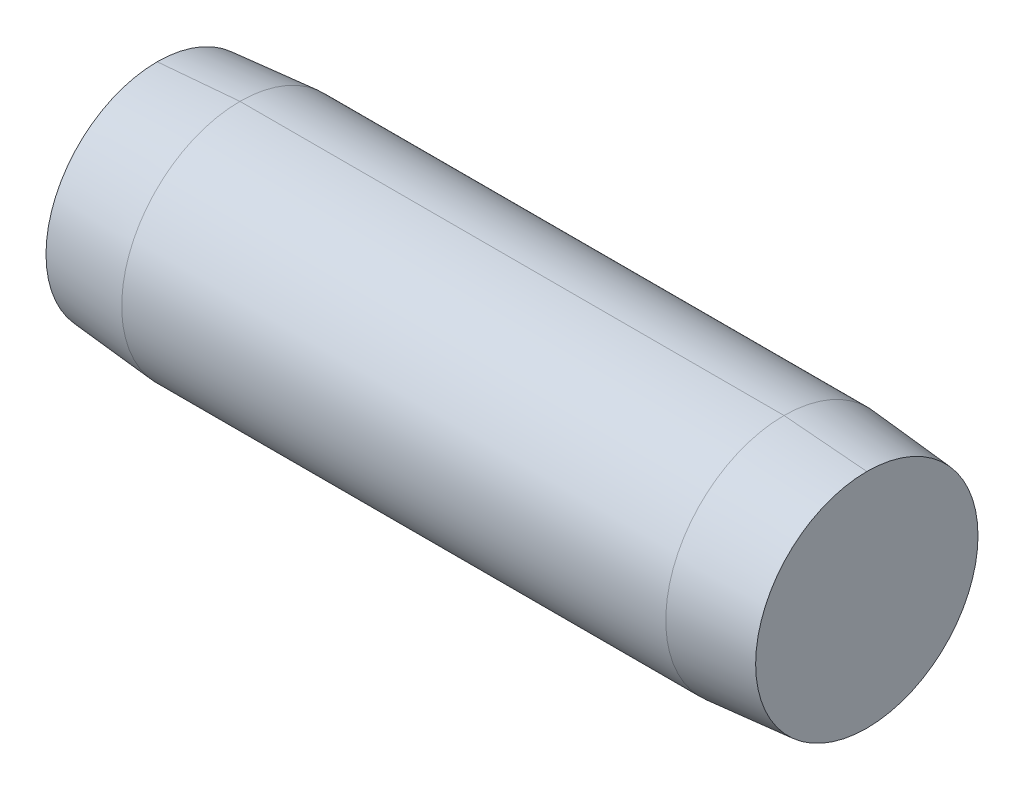
ISO-10303-21;
HEADER;
FILE_DESCRIPTION(('STEP AP214'),'2;1');
FILE_NAME('part.step','',(''),(''),'','','');
FILE_SCHEMA(('AUTOMOTIVE_DESIGN { 1 0 10303 214 1 1 1 1 }'));
ENDSEC;
DATA;
#1=APPLICATION_CONTEXT('core data for automotive mechanical design processes');
#2=APPLICATION_PROTOCOL_DEFINITION('international standard','automotive_design',2000,#1);
#3=PRODUCT_CONTEXT('',#1,'mechanical');
#4=PRODUCT('Part','Part','',(#3));
#5=PRODUCT_RELATED_PRODUCT_CATEGORY('part','',(#4));
#6=PRODUCT_DEFINITION_FORMATION('','',#4);
#7=PRODUCT_DEFINITION_CONTEXT('part definition',#1,'design');
#8=PRODUCT_DEFINITION('design','',#6,#7);
#9=PRODUCT_DEFINITION_SHAPE('','',#8);
#10=(LENGTH_UNIT() NAMED_UNIT(*) SI_UNIT(.MILLI.,.METRE.));
#11=(NAMED_UNIT(*) PLANE_ANGLE_UNIT() SI_UNIT($,.RADIAN.));
#12=(NAMED_UNIT(*) SI_UNIT($,.STERADIAN.) SOLID_ANGLE_UNIT());
#13=UNCERTAINTY_MEASURE_WITH_UNIT(LENGTH_MEASURE(1.E-05),#10,'distance_accuracy_value','');
#14=(GEOMETRIC_REPRESENTATION_CONTEXT(3) GLOBAL_UNCERTAINTY_ASSIGNED_CONTEXT((#13)) GLOBAL_UNIT_ASSIGNED_CONTEXT((#10,
#11,#12)) REPRESENTATION_CONTEXT('',''));
#15=CARTESIAN_POINT('',(0.,0.,0.));
#16=DIRECTION('',(0.,0.,1.));
#17=DIRECTION('',(1.,0.,0.));
#18=AXIS2_PLACEMENT_3D('',#15,#16,#17);
#19=CARTESIAN_POINT('',(2.650000000012,0.,0.));
#20=DIRECTION('',(-1.,0.,0.));
#21=DIRECTION('',(0.,0.,-1.));
#22=AXIS2_PLACEMENT_3D('',#19,#20,#21);
#23=CONICAL_SURFACE('',#22,0.969999999999,0.0855052936781931);
#24=DIRECTION('',(-0.996346649041751,-0.0854011413464358,2.30957380879689E-10));
#25=VECTOR('',#24,1.);
#26=CARTESIAN_POINT('',(3.000000000012,-0.9399999999989,-8.027746380345E-10));
#27=LINE('',#26,#25);
#28=CARTESIAN_POINT('',(3.,-0.94,0.));
#29=VERTEX_POINT('',#28);
#30=CARTESIAN_POINT('',(2.3,-1.,0.));
#31=VERTEX_POINT('',#30);
#32=EDGE_CURVE('E70',#29,#31,#27,.T.);
#33=ORIENTED_EDGE('',*,*,#32,.T.);
#34=CARTESIAN_POINT('',(2.3,0.,0.));
#35=DIRECTION('',(1.,0.,0.));
#36=DIRECTION('',(0.,-1.,0.));
#37=AXIS2_PLACEMENT_3D('',#34,#35,#36);
#38=CIRCLE('',#37,1.);
#39=CARTESIAN_POINT('',(2.3,1.,0.));
#40=VERTEX_POINT('',#39);
#41=EDGE_CURVE('E81',#31,#40,#38,.T.);
#42=ORIENTED_EDGE('',*,*,#41,.T.);
#43=DIRECTION('',(-0.996346649041751,0.0854011413464358,-2.30957564985689E-10));
#44=VECTOR('',#43,1.);
#45=CARTESIAN_POINT('',(3.000000000012,0.9399999999989,8.027750599361E-10));
#46=LINE('',#45,#44);
#47=CARTESIAN_POINT('',(3.,0.94,0.));
#48=VERTEX_POINT('',#47);
#49=EDGE_CURVE('E62',#48,#40,#46,.T.);
#50=ORIENTED_EDGE('',*,*,#49,.F.);
#51=CARTESIAN_POINT('',(3.,0.,0.));
#52=DIRECTION('',(1.,0.,0.));
#53=DIRECTION('',(0.,-1.,0.));
#54=AXIS2_PLACEMENT_3D('',#51,#52,#53);
#55=CIRCLE('',#54,0.94);
#56=EDGE_CURVE('E11',#29,#48,#55,.T.);
#57=ORIENTED_EDGE('',*,*,#56,.F.);
#58=EDGE_LOOP('',(#33,#42,#50,#57));
#59=FACE_BOUND('',#58,.T.);
#60=ADVANCED_FACE('F17',(#59),#23,.T.);
#61=CARTESIAN_POINT('',(3.,0.,0.));
#62=DIRECTION('',(1.,0.,0.));
#63=DIRECTION('',(0.,1.,0.));
#64=AXIS2_PLACEMENT_3D('',#61,#62,#63);
#65=PLANE('',#64);
#66=ORIENTED_EDGE('',*,*,#56,.T.);
#67=CARTESIAN_POINT('',(3.,0.,0.));
#68=DIRECTION('',(1.,0.,0.));
#69=DIRECTION('',(0.,1.,0.));
#70=AXIS2_PLACEMENT_3D('',#67,#68,#69);
#71=CIRCLE('',#70,0.94);
#72=EDGE_CURVE('E21',#48,#29,#71,.T.);
#73=ORIENTED_EDGE('',*,*,#72,.T.);
#74=EDGE_LOOP('',(#66,#73));
#75=FACE_BOUND('',#74,.T.);
#76=ADVANCED_FACE('F172',(#75),#65,.T.);
#77=CARTESIAN_POINT('',(2.650000000012,0.,0.));
#78=DIRECTION('',(-1.,0.,0.));
#79=DIRECTION('',(0.,0.,-1.));
#80=AXIS2_PLACEMENT_3D('',#77,#78,#79);
#81=CONICAL_SURFACE('',#80,0.969999999999,0.0855052936781931);
#82=ORIENTED_EDGE('',*,*,#49,.T.);
#83=CARTESIAN_POINT('',(2.3,0.,0.));
#84=DIRECTION('',(1.,0.,0.));
#85=DIRECTION('',(0.,1.,0.));
#86=AXIS2_PLACEMENT_3D('',#83,#84,#85);
#87=CIRCLE('',#86,1.);
#88=EDGE_CURVE('E66',#40,#31,#87,.T.);
#89=ORIENTED_EDGE('',*,*,#88,.T.);
#90=ORIENTED_EDGE('',*,*,#32,.F.);
#91=ORIENTED_EDGE('',*,*,#72,.F.);
#92=EDGE_LOOP('',(#82,#89,#90,#91));
#93=FACE_BOUND('',#92,.T.);
#94=ADVANCED_FACE('F64',(#93),#81,.T.);
#95=CARTESIAN_POINT('',(-3.,0.,0.));
#96=DIRECTION('',(1.,0.,0.));
#97=DIRECTION('',(0.,-1.,0.));
#98=AXIS2_PLACEMENT_3D('',#95,#96,#97);
#99=CYLINDRICAL_SURFACE('',#98,1.);
#100=DIRECTION('',(1.,0.,0.));
#101=VECTOR('',#100,1.);
#102=CARTESIAN_POINT('',(-2.30000000001,-0.9999999999992,-6.40511834374E-10));
#103=LINE('',#102,#101);
#104=CARTESIAN_POINT('',(-2.3,-1.,0.));
#105=VERTEX_POINT('',#104);
#106=EDGE_CURVE('E77',#105,#31,#103,.T.);
#107=ORIENTED_EDGE('',*,*,#106,.T.);
#108=ORIENTED_EDGE('',*,*,#88,.F.);
#109=DIRECTION('',(1.,0.,0.));
#110=VECTOR('',#109,1.);
#111=CARTESIAN_POINT('',(-2.30000000001,0.9999999999992,6.405120159065E-10));
#112=LINE('',#111,#110);
#113=CARTESIAN_POINT('',(-2.3,1.,0.));
#114=VERTEX_POINT('',#113);
#115=EDGE_CURVE('E75',#114,#40,#112,.T.);
#116=ORIENTED_EDGE('',*,*,#115,.F.);
#117=CARTESIAN_POINT('',(-2.3,0.,0.));
#118=DIRECTION('',(-1.,0.,0.));
#119=DIRECTION('',(0.,-1.,0.));
#120=AXIS2_PLACEMENT_3D('',#117,#118,#119);
#121=CIRCLE('',#120,1.);
#122=EDGE_CURVE('E108',#105,#114,#121,.T.);
#123=ORIENTED_EDGE('',*,*,#122,.F.);
#124=EDGE_LOOP('',(#107,#108,#116,#123));
#125=FACE_BOUND('',#124,.T.);
#126=ADVANCED_FACE('F19',(#125),#99,.T.);
#127=CARTESIAN_POINT('',(-3.,0.,0.));
#128=DIRECTION('',(1.,0.,0.));
#129=DIRECTION('',(0.,-1.,0.));
#130=AXIS2_PLACEMENT_3D('',#127,#128,#129);
#131=CYLINDRICAL_SURFACE('',#130,1.);
#132=ORIENTED_EDGE('',*,*,#115,.T.);
#133=ORIENTED_EDGE('',*,*,#41,.F.);
#134=ORIENTED_EDGE('',*,*,#106,.F.);
#135=CARTESIAN_POINT('',(-2.3,0.,0.));
#136=DIRECTION('',(-1.,0.,0.));
#137=DIRECTION('',(0.,1.,0.));
#138=AXIS2_PLACEMENT_3D('',#135,#136,#137);
#139=CIRCLE('',#138,1.);
#140=EDGE_CURVE('E87',#114,#105,#139,.T.);
#141=ORIENTED_EDGE('',*,*,#140,.F.);
#142=EDGE_LOOP('',(#132,#133,#134,#141));
#143=FACE_BOUND('',#142,.T.);
#144=ADVANCED_FACE('F85',(#143),#131,.T.);
#145=CARTESIAN_POINT('',(-2.650000000012,0.,0.));
#146=DIRECTION('',(1.,0.,0.));
#147=DIRECTION('',(0.,0.,-1.));
#148=AXIS2_PLACEMENT_3D('',#145,#146,#147);
#149=CONICAL_SURFACE('',#148,0.969999999999,0.0855052936781931);
#150=DIRECTION('',(0.996346649041751,0.0854011413464358,-2.30957684030388E-10));
#151=VECTOR('',#150,1.);
#152=CARTESIAN_POINT('',(-3.000000000012,0.9399999999989,8.027751990841E-10));
#153=LINE('',#152,#151);
#154=CARTESIAN_POINT('',(-3.,0.94,0.));
#155=VERTEX_POINT('',#154);
#156=EDGE_CURVE('E95',#155,#114,#153,.T.);
#157=ORIENTED_EDGE('',*,*,#156,.T.);
#158=ORIENTED_EDGE('',*,*,#140,.T.);
#159=DIRECTION('',(0.996346649041751,-0.0854011413464358,2.30957638985388E-10));
#160=VECTOR('',#159,1.);
#161=CARTESIAN_POINT('',(-3.000000000012,-0.9399999999989,-8.027749859044E-10));
#162=LINE('',#161,#160);
#163=CARTESIAN_POINT('',(-3.,-0.94,0.));
#164=VERTEX_POINT('',#163);
#165=EDGE_CURVE('E103',#164,#105,#162,.T.);
#166=ORIENTED_EDGE('',*,*,#165,.F.);
#167=CARTESIAN_POINT('',(-3.,0.,0.));
#168=DIRECTION('',(-1.,0.,0.));
#169=DIRECTION('',(0.,1.,0.));
#170=AXIS2_PLACEMENT_3D('',#167,#168,#169);
#171=CIRCLE('',#170,0.94);
#172=EDGE_CURVE('E104',#155,#164,#171,.T.);
#173=ORIENTED_EDGE('',*,*,#172,.F.);
#174=EDGE_LOOP('',(#157,#158,#166,#173));
#175=FACE_BOUND('',#174,.T.);
#176=ADVANCED_FACE('F123',(#175),#149,.T.);
#177=CARTESIAN_POINT('',(-2.650000000012,0.,0.));
#178=DIRECTION('',(1.,0.,0.));
#179=DIRECTION('',(0.,0.,-1.));
#180=AXIS2_PLACEMENT_3D('',#177,#178,#179);
#181=CONICAL_SURFACE('',#180,0.969999999999,0.0855052936781931);
#182=ORIENTED_EDGE('',*,*,#165,.T.);
#183=ORIENTED_EDGE('',*,*,#122,.T.);
#184=ORIENTED_EDGE('',*,*,#156,.F.);
#185=CARTESIAN_POINT('',(-3.,0.,0.));
#186=DIRECTION('',(-1.,0.,0.));
#187=DIRECTION('',(0.,-1.,0.));
#188=AXIS2_PLACEMENT_3D('',#185,#186,#187);
#189=CIRCLE('',#188,0.94);
#190=EDGE_CURVE('E99',#164,#155,#189,.T.);
#191=ORIENTED_EDGE('',*,*,#190,.F.);
#192=EDGE_LOOP('',(#182,#183,#184,#191));
#193=FACE_BOUND('',#192,.T.);
#194=ADVANCED_FACE('F128',(#193),#181,.T.);
#195=CARTESIAN_POINT('',(-3.,0.,0.));
#196=DIRECTION('',(1.,0.,0.));
#197=DIRECTION('',(0.,1.,0.));
#198=AXIS2_PLACEMENT_3D('',#195,#196,#197);
#199=PLANE('',#198);
#200=ORIENTED_EDGE('',*,*,#172,.T.);
#201=ORIENTED_EDGE('',*,*,#190,.T.);
#202=EDGE_LOOP('',(#200,#201));
#203=FACE_BOUND('',#202,.T.);
#204=ADVANCED_FACE('F153',(#203),#199,.F.);
#205=CLOSED_SHELL('',(#60,#76,#94,#126,#144,#176,#194,#204));
#206=MANIFOLD_SOLID_BREP('B1',#205);
#207=ADVANCED_BREP_SHAPE_REPRESENTATION('',(#18,#206),#14);
#208=SHAPE_DEFINITION_REPRESENTATION(#9,#207);
ENDSEC;
END-ISO-10303-21;
